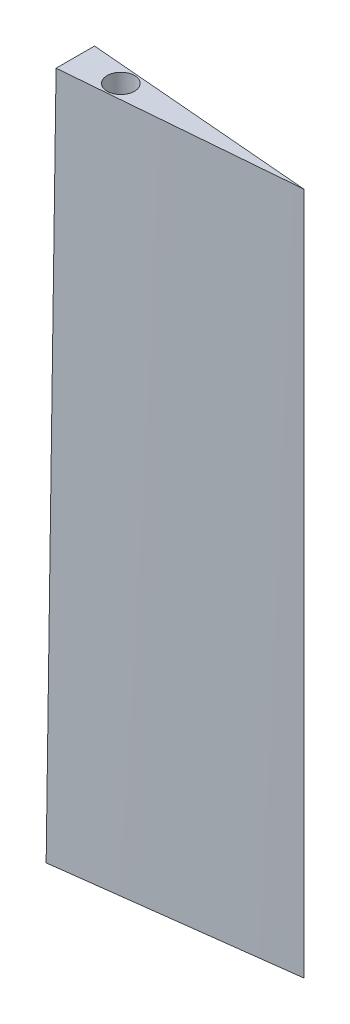
ISO-10303-21;
HEADER;
FILE_DESCRIPTION(('STEP AP214'),'2;1');
FILE_NAME('part.step','',(''),(''),'','','');
FILE_SCHEMA(('AUTOMOTIVE_DESIGN { 1 0 10303 214 1 1 1 1 }'));
ENDSEC;
DATA;
#1=APPLICATION_CONTEXT('core data for automotive mechanical design processes');
#2=APPLICATION_PROTOCOL_DEFINITION('international standard','automotive_design',2000,#1);
#3=PRODUCT_CONTEXT('',#1,'mechanical');
#4=PRODUCT('Part','Part','',(#3));
#5=PRODUCT_RELATED_PRODUCT_CATEGORY('part','',(#4));
#6=PRODUCT_DEFINITION_FORMATION('','',#4);
#7=PRODUCT_DEFINITION_CONTEXT('part definition',#1,'design');
#8=PRODUCT_DEFINITION('design','',#6,#7);
#9=PRODUCT_DEFINITION_SHAPE('','',#8);
#10=(LENGTH_UNIT() NAMED_UNIT(*) SI_UNIT(.MILLI.,.METRE.));
#11=(NAMED_UNIT(*) PLANE_ANGLE_UNIT() SI_UNIT($,.RADIAN.));
#12=(NAMED_UNIT(*) SI_UNIT($,.STERADIAN.) SOLID_ANGLE_UNIT());
#13=UNCERTAINTY_MEASURE_WITH_UNIT(LENGTH_MEASURE(1.E-05),#10,'distance_accuracy_value','');
#14=(GEOMETRIC_REPRESENTATION_CONTEXT(3) GLOBAL_UNCERTAINTY_ASSIGNED_CONTEXT((#13)) GLOBAL_UNIT_ASSIGNED_CONTEXT((#10,
#11,#12)) REPRESENTATION_CONTEXT('',''));
#15=CARTESIAN_POINT('',(0.,0.,0.));
#16=DIRECTION('',(0.,0.,1.));
#17=DIRECTION('',(1.,0.,0.));
#18=AXIS2_PLACEMENT_3D('',#15,#16,#17);
#19=CARTESIAN_POINT('',(0.,75.,0.));
#20=DIRECTION('',(0.,-1.,0.));
#21=DIRECTION('',(0.,0.,-1.));
#22=AXIS2_PLACEMENT_3D('',#19,#20,#21);
#23=PLANE('',#22);
#24=CARTESIAN_POINT('',(5.,75.,0.));
#25=DIRECTION('',(0.,-1.,0.));
#26=DIRECTION('',(0.,0.,-1.));
#27=AXIS2_PLACEMENT_3D('',#24,#25,#26);
#28=CIRCLE('',#27,1.5);
#29=CARTESIAN_POINT('',(5.,75.,-1.5));
#30=VERTEX_POINT('',#29);
#31=EDGE_CURVE('E110',#30,#30,#28,.T.);
#32=ORIENTED_EDGE('',*,*,#31,.T.);
#33=EDGE_LOOP('',(#32));
#34=FACE_BOUND('',#33,.T.);
#35=DIRECTION('',(-0.996482473200804,0.,-0.0838014355700955));
#36=VECTOR('',#35,1.);
#37=CARTESIAN_POINT('',(0.,75.,-2.11));
#38=LINE('',#37,#36);
#39=CARTESIAN_POINT('',(25.09,75.,0.));
#40=VERTEX_POINT('',#39);
#41=CARTESIAN_POINT('',(0.,75.,-2.11));
#42=VERTEX_POINT('',#41);
#43=EDGE_CURVE('E120',#40,#42,#38,.T.);
#44=ORIENTED_EDGE('',*,*,#43,.T.);
#45=DIRECTION('',(0.,0.,1.));
#46=VECTOR('',#45,1.);
#47=CARTESIAN_POINT('',(0.,75.,-2.11));
#48=LINE('',#47,#46);
#49=CARTESIAN_POINT('',(0.,75.,2.11));
#50=VERTEX_POINT('',#49);
#51=EDGE_CURVE('E12',#42,#50,#48,.T.);
#52=ORIENTED_EDGE('',*,*,#51,.T.);
#53=DIRECTION('',(0.996482473200804,0.,-0.0838014355700955));
#54=VECTOR('',#53,1.);
#55=CARTESIAN_POINT('',(25.09,75.,0.));
#56=LINE('',#55,#54);
#57=EDGE_CURVE('E58',#50,#40,#56,.T.);
#58=ORIENTED_EDGE('',*,*,#57,.T.);
#59=EDGE_LOOP('',(#44,#52,#58));
#60=FACE_BOUND('',#59,.T.);
#61=ADVANCED_FACE('F47',(#34,#60),#23,.F.);
#62=CARTESIAN_POINT('',(0.,0.,0.));
#63=DIRECTION('',(0.,-1.,0.));
#64=DIRECTION('',(0.,0.,-1.));
#65=AXIS2_PLACEMENT_3D('',#62,#63,#64);
#66=PLANE('',#65);
#67=CARTESIAN_POINT('',(5.,0.,0.));
#68=DIRECTION('',(0.,-1.,0.));
#69=DIRECTION('',(0.,0.,-1.));
#70=AXIS2_PLACEMENT_3D('',#67,#68,#69);
#71=CIRCLE('',#70,1.5);
#72=CARTESIAN_POINT('',(5.,0.,-1.5));
#73=VERTEX_POINT('',#72);
#74=EDGE_CURVE('E234',#73,#73,#71,.T.);
#75=ORIENTED_EDGE('',*,*,#74,.F.);
#76=EDGE_LOOP('',(#75));
#77=FACE_BOUND('',#76,.T.);
#78=DIRECTION('',(-0.991964565909674,0.,-0.126516006811915));
#79=VECTOR('',#78,1.);
#80=CARTESIAN_POINT('',(0.,0.,-3.2));
#81=LINE('',#80,#79);
#82=CARTESIAN_POINT('',(25.09,0.,0.));
#83=VERTEX_POINT('',#82);
#84=CARTESIAN_POINT('',(0.,0.,-3.2));
#85=VERTEX_POINT('',#84);
#86=EDGE_CURVE('E89',#83,#85,#81,.T.);
#87=ORIENTED_EDGE('',*,*,#86,.F.);
#88=DIRECTION('',(0.991964565909674,0.,-0.126516006811915));
#89=VECTOR('',#88,1.);
#90=CARTESIAN_POINT('',(25.09,0.,0.));
#91=LINE('',#90,#89);
#92=CARTESIAN_POINT('',(0.,0.,3.2));
#93=VERTEX_POINT('',#92);
#94=EDGE_CURVE('E91',#93,#83,#91,.T.);
#95=ORIENTED_EDGE('',*,*,#94,.F.);
#96=DIRECTION('',(0.,0.,1.));
#97=VECTOR('',#96,1.);
#98=CARTESIAN_POINT('',(0.,0.,-3.2));
#99=LINE('',#98,#97);
#100=EDGE_CURVE('E85',#85,#93,#99,.T.);
#101=ORIENTED_EDGE('',*,*,#100,.F.);
#102=EDGE_LOOP('',(#87,#95,#101));
#103=FACE_BOUND('',#102,.T.);
#104=ADVANCED_FACE('F88',(#77,#103),#66,.T.);
#105=CARTESIAN_POINT('',(0.,0.,0.));
#106=DIRECTION('',(1.,0.,0.));
#107=DIRECTION('',(0.,1.,0.));
#108=AXIS2_PLACEMENT_3D('',#105,#106,#107);
#109=PLANE('',#108);
#110=DIRECTION('',(0.,0.999894407838023,-0.0145317987272459));
#111=VECTOR('',#110,1.);
#112=CARTESIAN_POINT('',(0.,0.,3.2));
#113=LINE('',#112,#111);
#114=EDGE_CURVE('E98',#93,#50,#113,.T.);
#115=ORIENTED_EDGE('',*,*,#114,.T.);
#116=ORIENTED_EDGE('',*,*,#51,.F.);
#117=DIRECTION('',(0.,0.999894407838023,0.0145317987272459));
#118=VECTOR('',#117,1.);
#119=CARTESIAN_POINT('',(0.,0.,-3.2));
#120=LINE('',#119,#118);
#121=EDGE_CURVE('E106',#85,#42,#120,.T.);
#122=ORIENTED_EDGE('',*,*,#121,.F.);
#123=ORIENTED_EDGE('',*,*,#100,.T.);
#124=EDGE_LOOP('',(#115,#116,#122,#123));
#125=FACE_BOUND('',#124,.T.);
#126=ADVANCED_FACE('F114',(#125),#109,.F.);
#127=CARTESIAN_POINT('',(25.09,0.,0.));
#128=CARTESIAN_POINT('',(25.09,75.,0.));
#129=CARTESIAN_POINT('',(20.9083333333333,0.,-0.533333333333334));
#130=CARTESIAN_POINT('',(20.9083333333333,75.,-0.351666666666666));
#131=CARTESIAN_POINT('',(16.7266666666667,0.,-1.06666666666667));
#132=CARTESIAN_POINT('',(16.7266666666667,75.,-0.703333333333332));
#133=CARTESIAN_POINT('',(8.36333333333333,0.,-2.13333333333333));
#134=CARTESIAN_POINT('',(8.36333333333335,75.,-1.40666666666666));
#135=CARTESIAN_POINT('',(4.18166666666666,0.,-2.66666666666667));
#136=CARTESIAN_POINT('',(4.18166666666668,75.,-1.75833333333333));
#137=CARTESIAN_POINT('',(0.,0.,-3.2));
#138=CARTESIAN_POINT('',(0.,75.,-2.11));
#139=B_SPLINE_SURFACE_WITH_KNOTS('',3,1,((#127,#128),(#129,#130),(#131,#132),(#133,#134),(#135,
#136),(#137,#138)),.UNSPECIFIED.,.F.,.F.,.F.,(4,2,4),(2,2),(0.,0.5,1.),(0.,1.),.UNSPECIFIED.);
#140=DIRECTION('',(0.,1.,0.));
#141=VECTOR('',#140,1.);
#142=CARTESIAN_POINT('',(25.09,37.5,0.));
#143=LINE('',#142,#141);
#144=EDGE_CURVE('E108',#83,#40,#143,.T.);
#145=ORIENTED_EDGE('',*,*,#86,.T.);
#146=ORIENTED_EDGE('',*,*,#121,.T.);
#147=ORIENTED_EDGE('',*,*,#43,.F.);
#148=ORIENTED_EDGE('',*,*,#144,.F.);
#149=EDGE_LOOP('',(#145,#146,#147,#148));
#150=FACE_BOUND('',#149,.T.);
#151=ADVANCED_FACE('F105',(#150),#139,.T.);
#152=CARTESIAN_POINT('',(0.,0.,3.2));
#153=CARTESIAN_POINT('',(0.,75.,2.11));
#154=CARTESIAN_POINT('',(4.18166666666668,0.,2.66666666666667));
#155=CARTESIAN_POINT('',(4.18166666666668,75.,1.75833333333333));
#156=CARTESIAN_POINT('',(8.36333333333334,0.,2.13333333333333));
#157=CARTESIAN_POINT('',(8.36333333333335,75.,1.40666666666667));
#158=CARTESIAN_POINT('',(16.7266666666667,0.,1.06666666666667));
#159=CARTESIAN_POINT('',(16.7266666666667,75.,0.703333333333332));
#160=CARTESIAN_POINT('',(20.9083333333333,0.,0.533333333333332));
#161=CARTESIAN_POINT('',(20.9083333333333,75.,0.351666666666666));
#162=CARTESIAN_POINT('',(25.09,0.,0.));
#163=CARTESIAN_POINT('',(25.09,75.,0.));
#164=B_SPLINE_SURFACE_WITH_KNOTS('',3,1,((#152,#153),(#154,#155),(#156,#157),(#158,#159),(#160,
#161),(#162,#163)),.UNSPECIFIED.,.F.,.F.,.F.,(4,2,4),(2,2),(0.,0.5,1.),(0.,1.),.UNSPECIFIED.);
#165=ORIENTED_EDGE('',*,*,#94,.T.);
#166=ORIENTED_EDGE('',*,*,#144,.T.);
#167=ORIENTED_EDGE('',*,*,#57,.F.);
#168=ORIENTED_EDGE('',*,*,#114,.F.);
#169=EDGE_LOOP('',(#165,#166,#167,#168));
#170=FACE_BOUND('',#169,.T.);
#171=ADVANCED_FACE('F136',(#170),#164,.T.);
#172=CARTESIAN_POINT('',(5.,75.0001,0.));
#173=DIRECTION('',(0.,-1.,0.));
#174=DIRECTION('',(0.,0.,-1.));
#175=AXIS2_PLACEMENT_3D('',#172,#173,#174);
#176=CYLINDRICAL_SURFACE('',#175,1.5);
#177=ORIENTED_EDGE('',*,*,#74,.T.);
#178=EDGE_LOOP('',(#177));
#179=FACE_BOUND('',#178,.T.);
#180=ORIENTED_EDGE('',*,*,#31,.F.);
#181=EDGE_LOOP('',(#180));
#182=FACE_BOUND('',#181,.T.);
#183=ADVANCED_FACE('F147',(#179,#182),#176,.F.);
#184=CLOSED_SHELL('',(#61,#104,#126,#151,#171,#183));
#185=MANIFOLD_SOLID_BREP('B2',#184);
#186=ADVANCED_BREP_SHAPE_REPRESENTATION('',(#18,#185),#14);
#187=SHAPE_DEFINITION_REPRESENTATION(#9,#186);
ENDSEC;
END-ISO-10303-21;
